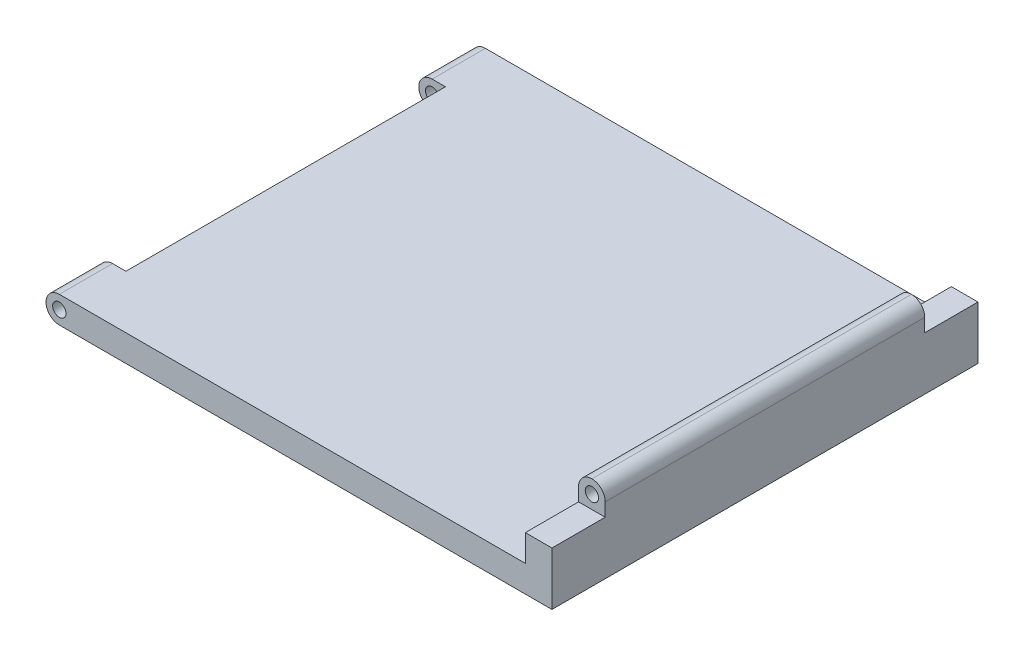
ISO-10303-21;
HEADER;
FILE_DESCRIPTION(('STEP AP214'),'2;1');
FILE_NAME('part.step','',(''),(''),'','','');
FILE_SCHEMA(('AUTOMOTIVE_DESIGN { 1 0 10303 214 1 1 1 1 }'));
ENDSEC;
DATA;
#1=APPLICATION_CONTEXT('core data for automotive mechanical design processes');
#2=APPLICATION_PROTOCOL_DEFINITION('international standard','automotive_design',2000,#1);
#3=PRODUCT_CONTEXT('',#1,'mechanical');
#4=PRODUCT('Part','Part','',(#3));
#5=PRODUCT_RELATED_PRODUCT_CATEGORY('part','',(#4));
#6=PRODUCT_DEFINITION_FORMATION('','',#4);
#7=PRODUCT_DEFINITION_CONTEXT('part definition',#1,'design');
#8=PRODUCT_DEFINITION('design','',#6,#7);
#9=PRODUCT_DEFINITION_SHAPE('','',#8);
#10=(LENGTH_UNIT() NAMED_UNIT(*) SI_UNIT(.MILLI.,.METRE.));
#11=(NAMED_UNIT(*) PLANE_ANGLE_UNIT() SI_UNIT($,.RADIAN.));
#12=(NAMED_UNIT(*) SI_UNIT($,.STERADIAN.) SOLID_ANGLE_UNIT());
#13=UNCERTAINTY_MEASURE_WITH_UNIT(LENGTH_MEASURE(1.E-05),#10,'distance_accuracy_value','');
#14=(GEOMETRIC_REPRESENTATION_CONTEXT(3) GLOBAL_UNCERTAINTY_ASSIGNED_CONTEXT((#13)) GLOBAL_UNIT_ASSIGNED_CONTEXT((#10,
#11,#12)) REPRESENTATION_CONTEXT('',''));
#15=CARTESIAN_POINT('',(0.,0.,0.));
#16=DIRECTION('',(0.,0.,1.));
#17=DIRECTION('',(1.,0.,0.));
#18=AXIS2_PLACEMENT_3D('',#15,#16,#17);
#19=CARTESIAN_POINT('',(90.,0.,40.));
#20=DIRECTION('',(-1.,0.,0.));
#21=DIRECTION('',(0.,0.,1.));
#22=AXIS2_PLACEMENT_3D('',#19,#20,#21);
#23=PLANE('',#22);
#24=DIRECTION('',(0.,1.,0.));
#25=VECTOR('',#24,1.);
#26=CARTESIAN_POINT('',(90.,15.,-30.));
#27=LINE('',#26,#25);
#28=CARTESIAN_POINT('',(90.,10.,-30.));
#29=VERTEX_POINT('',#28);
#30=CARTESIAN_POINT('',(90.,12.5,-30.));
#31=VERTEX_POINT('',#30);
#32=EDGE_CURVE('E263',#29,#31,#27,.T.);
#33=ORIENTED_EDGE('',*,*,#32,.T.);
#34=DIRECTION('',(0.,0.,-1.));
#35=VECTOR('',#34,1.);
#36=CARTESIAN_POINT('',(90.,12.5,40.));
#37=LINE('',#36,#35);
#38=CARTESIAN_POINT('',(90.,12.5,30.));
#39=VERTEX_POINT('',#38);
#40=EDGE_CURVE('E11',#31,#39,#37,.F.);
#41=ORIENTED_EDGE('',*,*,#40,.T.);
#42=DIRECTION('',(0.,1.,0.));
#43=VECTOR('',#42,1.);
#44=CARTESIAN_POINT('',(90.,15.,30.));
#45=LINE('',#44,#43);
#46=CARTESIAN_POINT('',(90.,10.,30.));
#47=VERTEX_POINT('',#46);
#48=EDGE_CURVE('E163',#47,#39,#45,.T.);
#49=ORIENTED_EDGE('',*,*,#48,.F.);
#50=DIRECTION('',(0.,0.,-1.));
#51=VECTOR('',#50,1.);
#52=CARTESIAN_POINT('',(90.,10.,40.));
#53=LINE('',#52,#51);
#54=CARTESIAN_POINT('',(90.,10.,40.));
#55=VERTEX_POINT('',#54);
#56=EDGE_CURVE('E151',#55,#47,#53,.T.);
#57=ORIENTED_EDGE('',*,*,#56,.F.);
#58=DIRECTION('',(0.,1.,0.));
#59=VECTOR('',#58,1.);
#60=CARTESIAN_POINT('',(90.,0.,40.));
#61=LINE('',#60,#59);
#62=CARTESIAN_POINT('',(90.,0.,40.));
#63=VERTEX_POINT('',#62);
#64=EDGE_CURVE('E162',#63,#55,#61,.T.);
#65=ORIENTED_EDGE('',*,*,#64,.F.);
#66=DIRECTION('',(0.,0.,-1.));
#67=VECTOR('',#66,1.);
#68=CARTESIAN_POINT('',(90.,0.,40.));
#69=LINE('',#68,#67);
#70=CARTESIAN_POINT('',(90.,0.,-40.));
#71=VERTEX_POINT('',#70);
#72=EDGE_CURVE('E203',#63,#71,#69,.T.);
#73=ORIENTED_EDGE('',*,*,#72,.T.);
#74=DIRECTION('',(0.,1.,0.));
#75=VECTOR('',#74,1.);
#76=CARTESIAN_POINT('',(90.,0.,-40.));
#77=LINE('',#76,#75);
#78=CARTESIAN_POINT('',(90.,10.,-40.));
#79=VERTEX_POINT('',#78);
#80=EDGE_CURVE('E187',#71,#79,#77,.T.);
#81=ORIENTED_EDGE('',*,*,#80,.T.);
#82=DIRECTION('',(0.,0.,1.));
#83=VECTOR('',#82,1.);
#84=CARTESIAN_POINT('',(90.,10.,-40.));
#85=LINE('',#84,#83);
#86=EDGE_CURVE('E274',#79,#29,#85,.T.);
#87=ORIENTED_EDGE('',*,*,#86,.T.);
#88=EDGE_LOOP('',(#33,#41,#49,#57,#65,#73,#81,#87));
#89=FACE_BOUND('',#88,.T.);
#90=ADVANCED_FACE('F38',(#89),#23,.F.);
#91=CARTESIAN_POINT('',(85.,15.,40.));
#92=DIRECTION('',(1.,0.,0.));
#93=DIRECTION('',(0.,0.,-1.));
#94=AXIS2_PLACEMENT_3D('',#91,#92,#93);
#95=PLANE('',#94);
#96=DIRECTION('',(0.,-1.,0.));
#97=VECTOR('',#96,1.);
#98=CARTESIAN_POINT('',(85.,15.,30.));
#99=LINE('',#98,#97);
#100=CARTESIAN_POINT('',(85.,12.5,30.));
#101=VERTEX_POINT('',#100);
#102=CARTESIAN_POINT('',(85.,10.,30.));
#103=VERTEX_POINT('',#102);
#104=EDGE_CURVE('E231',#101,#103,#99,.T.);
#105=ORIENTED_EDGE('',*,*,#104,.F.);
#106=DIRECTION('',(0.,0.,-1.));
#107=VECTOR('',#106,1.);
#108=CARTESIAN_POINT('',(85.,12.5,40.));
#109=LINE('',#108,#107);
#110=CARTESIAN_POINT('',(85.,12.5,-30.));
#111=VERTEX_POINT('',#110);
#112=EDGE_CURVE('E210',#101,#111,#109,.T.);
#113=ORIENTED_EDGE('',*,*,#112,.T.);
#114=DIRECTION('',(0.,-1.,0.));
#115=VECTOR('',#114,1.);
#116=CARTESIAN_POINT('',(85.,15.,-30.));
#117=LINE('',#116,#115);
#118=CARTESIAN_POINT('',(85.,10.,-30.));
#119=VERTEX_POINT('',#118);
#120=EDGE_CURVE('E245',#111,#119,#117,.T.);
#121=ORIENTED_EDGE('',*,*,#120,.T.);
#122=DIRECTION('',(0.,0.,1.));
#123=VECTOR('',#122,1.);
#124=CARTESIAN_POINT('',(85.,10.,-40.));
#125=LINE('',#124,#123);
#126=CARTESIAN_POINT('',(85.,10.,-40.));
#127=VERTEX_POINT('',#126);
#128=EDGE_CURVE('E270',#127,#119,#125,.T.);
#129=ORIENTED_EDGE('',*,*,#128,.F.);
#130=DIRECTION('',(0.,-1.,0.));
#131=VECTOR('',#130,1.);
#132=CARTESIAN_POINT('',(85.,15.,-40.));
#133=LINE('',#132,#131);
#134=CARTESIAN_POINT('',(85.,5.00000000000001,-40.));
#135=VERTEX_POINT('',#134);
#136=EDGE_CURVE('E192',#127,#135,#133,.T.);
#137=ORIENTED_EDGE('',*,*,#136,.T.);
#138=DIRECTION('',(0.,0.,-1.));
#139=VECTOR('',#138,1.);
#140=CARTESIAN_POINT('',(85.,5.00000000000001,40.));
#141=LINE('',#140,#139);
#142=CARTESIAN_POINT('',(85.,5.00000000000001,40.));
#143=VERTEX_POINT('',#142);
#144=EDGE_CURVE('E199',#143,#135,#141,.T.);
#145=ORIENTED_EDGE('',*,*,#144,.F.);
#146=DIRECTION('',(0.,-1.,0.));
#147=VECTOR('',#146,1.);
#148=CARTESIAN_POINT('',(85.,15.,40.));
#149=LINE('',#148,#147);
#150=CARTESIAN_POINT('',(85.,10.,40.));
#151=VERTEX_POINT('',#150);
#152=EDGE_CURVE('E171',#151,#143,#149,.T.);
#153=ORIENTED_EDGE('',*,*,#152,.F.);
#154=DIRECTION('',(0.,0.,-1.));
#155=VECTOR('',#154,1.);
#156=CARTESIAN_POINT('',(85.,10.,40.));
#157=LINE('',#156,#155);
#158=EDGE_CURVE('E153',#151,#103,#157,.T.);
#159=ORIENTED_EDGE('',*,*,#158,.T.);
#160=EDGE_LOOP('',(#105,#113,#121,#129,#137,#145,#153,#159));
#161=FACE_BOUND('',#160,.T.);
#162=ADVANCED_FACE('F236',(#161),#95,.F.);
#163=CARTESIAN_POINT('',(0.,0.,40.));
#164=DIRECTION('',(0.,0.,1.));
#165=DIRECTION('',(1.,0.,0.));
#166=AXIS2_PLACEMENT_3D('',#163,#164,#165);
#167=PLANE('',#166);
#168=CARTESIAN_POINT('',(-2.5,2.5,40.));
#169=DIRECTION('',(0.,0.,1.));
#170=DIRECTION('',(1.,0.,0.));
#171=AXIS2_PLACEMENT_3D('',#168,#169,#170);
#172=CIRCLE('',#171,1.25);
#173=CARTESIAN_POINT('',(-1.25,2.5,40.));
#174=VERTEX_POINT('',#173);
#175=EDGE_CURVE('E316',#174,#174,#172,.T.);
#176=ORIENTED_EDGE('',*,*,#175,.F.);
#177=EDGE_LOOP('',(#176));
#178=FACE_BOUND('',#177,.T.);
#179=ORIENTED_EDGE('',*,*,#64,.T.);
#180=DIRECTION('',(1.,0.,0.));
#181=VECTOR('',#180,1.);
#182=CARTESIAN_POINT('',(85.,10.,40.));
#183=LINE('',#182,#181);
#184=EDGE_CURVE('E147',#151,#55,#183,.T.);
#185=ORIENTED_EDGE('',*,*,#184,.F.);
#186=ORIENTED_EDGE('',*,*,#152,.T.);
#187=DIRECTION('',(-1.,0.,0.));
#188=VECTOR('',#187,1.);
#189=CARTESIAN_POINT('',(85.,5.00000000000001,40.));
#190=LINE('',#189,#188);
#191=CARTESIAN_POINT('',(-2.5,5.,40.));
#192=VERTEX_POINT('',#191);
#193=EDGE_CURVE('E175',#143,#192,#190,.T.);
#194=ORIENTED_EDGE('',*,*,#193,.T.);
#195=CARTESIAN_POINT('',(-2.5,2.5,40.));
#196=DIRECTION('',(0.,0.,1.));
#197=DIRECTION('',(1.,0.,0.));
#198=AXIS2_PLACEMENT_3D('',#195,#196,#197);
#199=CIRCLE('',#198,2.5);
#200=CARTESIAN_POINT('',(-2.5,0.,40.));
#201=VERTEX_POINT('',#200);
#202=EDGE_CURVE('E333',#192,#201,#199,.T.);
#203=ORIENTED_EDGE('',*,*,#202,.T.);
#204=DIRECTION('',(1.,0.,0.));
#205=VECTOR('',#204,1.);
#206=CARTESIAN_POINT('',(0.,0.,40.));
#207=LINE('',#206,#205);
#208=EDGE_CURVE('E168',#201,#63,#207,.T.);
#209=ORIENTED_EDGE('',*,*,#208,.T.);
#210=EDGE_LOOP('',(#179,#185,#186,#194,#203,#209));
#211=FACE_BOUND('',#210,.T.);
#212=ADVANCED_FACE('F166',(#178,#211),#167,.T.);
#213=CARTESIAN_POINT('',(0.,5.,40.));
#214=DIRECTION('',(1.,0.,0.));
#215=DIRECTION('',(0.,1.,0.));
#216=AXIS2_PLACEMENT_3D('',#213,#214,#215);
#217=PLANE('',#216);
#218=DIRECTION('',(0.,1.,0.));
#219=VECTOR('',#218,1.);
#220=CARTESIAN_POINT('',(0.,0.,-30.));
#221=LINE('',#220,#219);
#222=CARTESIAN_POINT('',(0.,0.,-30.));
#223=VERTEX_POINT('',#222);
#224=CARTESIAN_POINT('',(0.,5.,-30.));
#225=VERTEX_POINT('',#224);
#226=EDGE_CURVE('E286',#223,#225,#221,.T.);
#227=ORIENTED_EDGE('',*,*,#226,.F.);
#228=DIRECTION('',(0.,0.,-1.));
#229=VECTOR('',#228,1.);
#230=CARTESIAN_POINT('',(0.,0.,40.));
#231=LINE('',#230,#229);
#232=CARTESIAN_POINT('',(0.,0.,30.));
#233=VERTEX_POINT('',#232);
#234=EDGE_CURVE('E206',#233,#223,#231,.T.);
#235=ORIENTED_EDGE('',*,*,#234,.F.);
#236=DIRECTION('',(0.,1.,0.));
#237=VECTOR('',#236,1.);
#238=CARTESIAN_POINT('',(0.,0.,30.));
#239=LINE('',#238,#237);
#240=CARTESIAN_POINT('',(0.,5.,30.));
#241=VERTEX_POINT('',#240);
#242=EDGE_CURVE('E320',#233,#241,#239,.T.);
#243=ORIENTED_EDGE('',*,*,#242,.T.);
#244=DIRECTION('',(0.,0.,-1.));
#245=VECTOR('',#244,1.);
#246=CARTESIAN_POINT('',(0.,5.,40.));
#247=LINE('',#246,#245);
#248=EDGE_CURVE('E183',#241,#225,#247,.T.);
#249=ORIENTED_EDGE('',*,*,#248,.T.);
#250=EDGE_LOOP('',(#227,#235,#243,#249));
#251=FACE_BOUND('',#250,.T.);
#252=ADVANCED_FACE('F378',(#251),#217,.F.);
#253=CARTESIAN_POINT('',(0.,0.,40.));
#254=DIRECTION('',(0.,1.,0.));
#255=DIRECTION('',(0.,0.,1.));
#256=AXIS2_PLACEMENT_3D('',#253,#254,#255);
#257=PLANE('',#256);
#258=DIRECTION('',(1.,0.,0.));
#259=VECTOR('',#258,1.);
#260=CARTESIAN_POINT('',(0.,0.,-40.));
#261=LINE('',#260,#259);
#262=CARTESIAN_POINT('',(-2.5,0.,-40.));
#263=VERTEX_POINT('',#262);
#264=EDGE_CURVE('E184',#263,#71,#261,.T.);
#265=ORIENTED_EDGE('',*,*,#264,.T.);
#266=ORIENTED_EDGE('',*,*,#72,.F.);
#267=ORIENTED_EDGE('',*,*,#208,.F.);
#268=DIRECTION('',(0.,0.,-1.));
#269=VECTOR('',#268,1.);
#270=CARTESIAN_POINT('',(-2.5,0.,40.));
#271=LINE('',#270,#269);
#272=CARTESIAN_POINT('',(-2.5,0.,30.));
#273=VERTEX_POINT('',#272);
#274=EDGE_CURVE('E336',#201,#273,#271,.T.);
#275=ORIENTED_EDGE('',*,*,#274,.T.);
#276=DIRECTION('',(1.,0.,0.));
#277=VECTOR('',#276,1.);
#278=CARTESIAN_POINT('',(-2.5,0.,30.));
#279=LINE('',#278,#277);
#280=EDGE_CURVE('E330',#273,#233,#279,.T.);
#281=ORIENTED_EDGE('',*,*,#280,.T.);
#282=ORIENTED_EDGE('',*,*,#234,.T.);
#283=DIRECTION('',(1.,0.,0.));
#284=VECTOR('',#283,1.);
#285=CARTESIAN_POINT('',(-2.5,0.,-30.));
#286=LINE('',#285,#284);
#287=CARTESIAN_POINT('',(-2.5,0.,-30.));
#288=VERTEX_POINT('',#287);
#289=EDGE_CURVE('E290',#288,#223,#286,.T.);
#290=ORIENTED_EDGE('',*,*,#289,.F.);
#291=DIRECTION('',(0.,0.,1.));
#292=VECTOR('',#291,1.);
#293=CARTESIAN_POINT('',(-2.5,0.,-40.));
#294=LINE('',#293,#292);
#295=EDGE_CURVE('E309',#263,#288,#294,.T.);
#296=ORIENTED_EDGE('',*,*,#295,.F.);
#297=EDGE_LOOP('',(#265,#266,#267,#275,#281,#282,#290,#296));
#298=FACE_BOUND('',#297,.T.);
#299=ADVANCED_FACE('F357',(#298),#257,.F.);
#300=CARTESIAN_POINT('',(85.,5.00000000000001,40.));
#301=DIRECTION('',(0.,-1.,0.));
#302=DIRECTION('',(1.,0.,0.));
#303=AXIS2_PLACEMENT_3D('',#300,#301,#302);
#304=PLANE('',#303);
#305=DIRECTION('',(-1.,0.,0.));
#306=VECTOR('',#305,1.);
#307=CARTESIAN_POINT('',(85.,5.00000000000001,-40.));
#308=LINE('',#307,#306);
#309=CARTESIAN_POINT('',(-2.5,5.,-40.));
#310=VERTEX_POINT('',#309);
#311=EDGE_CURVE('E177',#135,#310,#308,.T.);
#312=ORIENTED_EDGE('',*,*,#311,.T.);
#313=DIRECTION('',(0.,0.,1.));
#314=VECTOR('',#313,1.);
#315=CARTESIAN_POINT('',(-2.5,5.,-40.));
#316=LINE('',#315,#314);
#317=CARTESIAN_POINT('',(-2.5,5.,-30.));
#318=VERTEX_POINT('',#317);
#319=EDGE_CURVE('E306',#310,#318,#316,.T.);
#320=ORIENTED_EDGE('',*,*,#319,.T.);
#321=DIRECTION('',(-1.,0.,0.));
#322=VECTOR('',#321,1.);
#323=CARTESIAN_POINT('',(0.,5.,-30.));
#324=LINE('',#323,#322);
#325=EDGE_CURVE('E298',#225,#318,#324,.T.);
#326=ORIENTED_EDGE('',*,*,#325,.F.);
#327=ORIENTED_EDGE('',*,*,#248,.F.);
#328=DIRECTION('',(-1.,0.,0.));
#329=VECTOR('',#328,1.);
#330=CARTESIAN_POINT('',(0.,5.,30.));
#331=LINE('',#330,#329);
#332=CARTESIAN_POINT('',(-2.5,5.,30.));
#333=VERTEX_POINT('',#332);
#334=EDGE_CURVE('E324',#241,#333,#331,.T.);
#335=ORIENTED_EDGE('',*,*,#334,.T.);
#336=DIRECTION('',(0.,0.,-1.));
#337=VECTOR('',#336,1.);
#338=CARTESIAN_POINT('',(-2.5,5.,40.));
#339=LINE('',#338,#337);
#340=EDGE_CURVE('E188',#192,#333,#339,.T.);
#341=ORIENTED_EDGE('',*,*,#340,.F.);
#342=ORIENTED_EDGE('',*,*,#193,.F.);
#343=ORIENTED_EDGE('',*,*,#144,.T.);
#344=EDGE_LOOP('',(#312,#320,#326,#327,#335,#341,#342,#343));
#345=FACE_BOUND('',#344,.T.);
#346=ADVANCED_FACE('F360',(#345),#304,.F.);
#347=CARTESIAN_POINT('',(0.,0.,-40.));
#348=DIRECTION('',(0.,0.,1.));
#349=DIRECTION('',(1.,0.,0.));
#350=AXIS2_PLACEMENT_3D('',#347,#348,#349);
#351=PLANE('',#350);
#352=ORIENTED_EDGE('',*,*,#136,.F.);
#353=DIRECTION('',(1.,0.,0.));
#354=VECTOR('',#353,1.);
#355=CARTESIAN_POINT('',(85.,10.,-40.));
#356=LINE('',#355,#354);
#357=EDGE_CURVE('E266',#127,#79,#356,.T.);
#358=ORIENTED_EDGE('',*,*,#357,.T.);
#359=ORIENTED_EDGE('',*,*,#80,.F.);
#360=ORIENTED_EDGE('',*,*,#264,.F.);
#361=CARTESIAN_POINT('',(-2.5,2.5,-40.));
#362=DIRECTION('',(0.,0.,1.));
#363=DIRECTION('',(1.,0.,0.));
#364=AXIS2_PLACEMENT_3D('',#361,#362,#363);
#365=CIRCLE('',#364,2.5);
#366=EDGE_CURVE('E302',#310,#263,#365,.T.);
#367=ORIENTED_EDGE('',*,*,#366,.F.);
#368=ORIENTED_EDGE('',*,*,#311,.F.);
#369=EDGE_LOOP('',(#352,#358,#359,#360,#367,#368));
#370=FACE_BOUND('',#369,.T.);
#371=CARTESIAN_POINT('',(-2.5,2.5,-40.));
#372=DIRECTION('',(0.,0.,1.));
#373=DIRECTION('',(1.,0.,0.));
#374=AXIS2_PLACEMENT_3D('',#371,#372,#373);
#375=CIRCLE('',#374,1.25);
#376=CARTESIAN_POINT('',(-1.25,2.5,-40.));
#377=VERTEX_POINT('',#376);
#378=EDGE_CURVE('E282',#377,#377,#375,.T.);
#379=ORIENTED_EDGE('',*,*,#378,.T.);
#380=EDGE_LOOP('',(#379));
#381=FACE_BOUND('',#380,.T.);
#382=ADVANCED_FACE('F366',(#370,#381),#351,.F.);
#383=CARTESIAN_POINT('',(-2.5,2.5,30.));
#384=DIRECTION('',(0.,0.,1.));
#385=DIRECTION('',(1.,0.,0.));
#386=AXIS2_PLACEMENT_3D('',#383,#384,#385);
#387=PLANE('',#386);
#388=ORIENTED_EDGE('',*,*,#242,.F.);
#389=ORIENTED_EDGE('',*,*,#280,.F.);
#390=CARTESIAN_POINT('',(-2.5,2.5,30.));
#391=DIRECTION('',(0.,0.,1.));
#392=DIRECTION('',(1.,0.,0.));
#393=AXIS2_PLACEMENT_3D('',#390,#391,#392);
#394=CIRCLE('',#393,2.5);
#395=EDGE_CURVE('E327',#333,#273,#394,.T.);
#396=ORIENTED_EDGE('',*,*,#395,.F.);
#397=ORIENTED_EDGE('',*,*,#334,.F.);
#398=EDGE_LOOP('',(#388,#389,#396,#397));
#399=FACE_BOUND('',#398,.T.);
#400=CARTESIAN_POINT('',(-2.5,2.5,30.));
#401=DIRECTION('',(0.,0.,1.));
#402=DIRECTION('',(1.,0.,0.));
#403=AXIS2_PLACEMENT_3D('',#400,#401,#402);
#404=CIRCLE('',#403,1.25);
#405=CARTESIAN_POINT('',(-1.25,2.5,30.));
#406=VERTEX_POINT('',#405);
#407=EDGE_CURVE('E312',#406,#406,#404,.T.);
#408=ORIENTED_EDGE('',*,*,#407,.T.);
#409=EDGE_LOOP('',(#408));
#410=FACE_BOUND('',#409,.T.);
#411=ADVANCED_FACE('F353',(#399,#410),#387,.F.);
#412=CARTESIAN_POINT('',(-2.5,2.5,40.));
#413=DIRECTION('',(0.,0.,-1.));
#414=DIRECTION('',(-1.,0.,0.));
#415=AXIS2_PLACEMENT_3D('',#412,#413,#414);
#416=CYLINDRICAL_SURFACE('',#415,2.5);
#417=ORIENTED_EDGE('',*,*,#395,.T.);
#418=ORIENTED_EDGE('',*,*,#274,.F.);
#419=ORIENTED_EDGE('',*,*,#202,.F.);
#420=ORIENTED_EDGE('',*,*,#340,.T.);
#421=EDGE_LOOP('',(#417,#418,#419,#420));
#422=FACE_BOUND('',#421,.T.);
#423=ADVANCED_FACE('F346',(#422),#416,.T.);
#424=CARTESIAN_POINT('',(-2.5,2.5,40.));
#425=DIRECTION('',(0.,0.,-1.));
#426=DIRECTION('',(-1.,0.,0.));
#427=AXIS2_PLACEMENT_3D('',#424,#425,#426);
#428=CYLINDRICAL_SURFACE('',#427,1.25);
#429=ORIENTED_EDGE('',*,*,#175,.T.);
#430=EDGE_LOOP('',(#429));
#431=FACE_BOUND('',#430,.T.);
#432=ORIENTED_EDGE('',*,*,#407,.F.);
#433=EDGE_LOOP('',(#432));
#434=FACE_BOUND('',#433,.T.);
#435=ADVANCED_FACE('F402',(#431,#434),#428,.F.);
#436=CARTESIAN_POINT('',(-2.5,2.5,-40.));
#437=DIRECTION('',(0.,0.,1.));
#438=DIRECTION('',(1.,0.,0.));
#439=AXIS2_PLACEMENT_3D('',#436,#437,#438);
#440=CYLINDRICAL_SURFACE('',#439,2.5);
#441=CARTESIAN_POINT('',(-2.5,2.5,-30.));
#442=DIRECTION('',(0.,0.,1.));
#443=DIRECTION('',(1.,0.,0.));
#444=AXIS2_PLACEMENT_3D('',#441,#442,#443);
#445=CIRCLE('',#444,2.5);
#446=EDGE_CURVE('E294',#318,#288,#445,.T.);
#447=ORIENTED_EDGE('',*,*,#446,.F.);
#448=ORIENTED_EDGE('',*,*,#319,.F.);
#449=ORIENTED_EDGE('',*,*,#366,.T.);
#450=ORIENTED_EDGE('',*,*,#295,.T.);
#451=EDGE_LOOP('',(#447,#448,#449,#450));
#452=FACE_BOUND('',#451,.T.);
#453=ADVANCED_FACE('F372',(#452),#440,.T.);
#454=CARTESIAN_POINT('',(-2.5,2.5,-30.));
#455=DIRECTION('',(0.,0.,-1.));
#456=DIRECTION('',(1.,0.,0.));
#457=AXIS2_PLACEMENT_3D('',#454,#455,#456);
#458=PLANE('',#457);
#459=CARTESIAN_POINT('',(-2.5,2.5,-30.));
#460=DIRECTION('',(0.,0.,1.));
#461=DIRECTION('',(1.,0.,0.));
#462=AXIS2_PLACEMENT_3D('',#459,#460,#461);
#463=CIRCLE('',#462,1.25);
#464=CARTESIAN_POINT('',(-1.25,2.5,-30.));
#465=VERTEX_POINT('',#464);
#466=EDGE_CURVE('E278',#465,#465,#463,.T.);
#467=ORIENTED_EDGE('',*,*,#466,.F.);
#468=EDGE_LOOP('',(#467));
#469=FACE_BOUND('',#468,.T.);
#470=ORIENTED_EDGE('',*,*,#226,.T.);
#471=ORIENTED_EDGE('',*,*,#325,.T.);
#472=ORIENTED_EDGE('',*,*,#446,.T.);
#473=ORIENTED_EDGE('',*,*,#289,.T.);
#474=EDGE_LOOP('',(#470,#471,#472,#473));
#475=FACE_BOUND('',#474,.T.);
#476=ADVANCED_FACE('F376',(#469,#475),#458,.F.);
#477=CARTESIAN_POINT('',(-2.5,2.5,-40.));
#478=DIRECTION('',(0.,0.,1.));
#479=DIRECTION('',(1.,0.,0.));
#480=AXIS2_PLACEMENT_3D('',#477,#478,#479);
#481=CYLINDRICAL_SURFACE('',#480,1.25);
#482=ORIENTED_EDGE('',*,*,#378,.F.);
#483=EDGE_LOOP('',(#482));
#484=FACE_BOUND('',#483,.T.);
#485=ORIENTED_EDGE('',*,*,#466,.T.);
#486=EDGE_LOOP('',(#485));
#487=FACE_BOUND('',#486,.T.);
#488=ADVANCED_FACE('F412',(#484,#487),#481,.F.);
#489=CARTESIAN_POINT('',(85.,10.,-40.));
#490=DIRECTION('',(0.,-1.,0.));
#491=DIRECTION('',(0.,0.,-1.));
#492=AXIS2_PLACEMENT_3D('',#489,#490,#491);
#493=PLANE('',#492);
#494=DIRECTION('',(1.,0.,0.));
#495=VECTOR('',#494,1.);
#496=CARTESIAN_POINT('',(85.,10.,-30.));
#497=LINE('',#496,#495);
#498=EDGE_CURVE('E259',#119,#29,#497,.T.);
#499=ORIENTED_EDGE('',*,*,#498,.T.);
#500=ORIENTED_EDGE('',*,*,#86,.F.);
#501=ORIENTED_EDGE('',*,*,#357,.F.);
#502=ORIENTED_EDGE('',*,*,#128,.T.);
#503=EDGE_LOOP('',(#499,#500,#501,#502));
#504=FACE_BOUND('',#503,.T.);
#505=ADVANCED_FACE('F416',(#504),#493,.F.);
#506=CARTESIAN_POINT('',(0.,0.,-30.));
#507=DIRECTION('',(0.,0.,1.));
#508=DIRECTION('',(1.,0.,0.));
#509=AXIS2_PLACEMENT_3D('',#506,#507,#508);
#510=PLANE('',#509);
#511=CARTESIAN_POINT('',(87.5,12.5,-30.));
#512=DIRECTION('',(0.,0.,1.));
#513=DIRECTION('',(1.,0.,0.));
#514=AXIS2_PLACEMENT_3D('',#511,#512,#513);
#515=CIRCLE('',#514,1.25);
#516=CARTESIAN_POINT('',(88.75,12.5,-30.));
#517=VERTEX_POINT('',#516);
#518=EDGE_CURVE('E215',#517,#517,#515,.T.);
#519=ORIENTED_EDGE('',*,*,#518,.T.);
#520=EDGE_LOOP('',(#519));
#521=FACE_BOUND('',#520,.T.);
#522=ORIENTED_EDGE('',*,*,#120,.F.);
#523=CARTESIAN_POINT('',(87.5,12.5,-30.));
#524=DIRECTION('',(0.,0.,1.));
#525=DIRECTION('',(1.,0.,0.));
#526=AXIS2_PLACEMENT_3D('',#523,#524,#525);
#527=CIRCLE('',#526,2.5);
#528=CARTESIAN_POINT('',(87.5,15.,-30.));
#529=VERTEX_POINT('',#528);
#530=EDGE_CURVE('E222',#111,#529,#527,.F.);
#531=ORIENTED_EDGE('',*,*,#530,.T.);
#532=CARTESIAN_POINT('',(87.5,12.5,-30.));
#533=DIRECTION('',(0.,0.,1.));
#534=DIRECTION('',(1.,0.,0.));
#535=AXIS2_PLACEMENT_3D('',#532,#533,#534);
#536=CIRCLE('',#535,2.5);
#537=EDGE_CURVE('E219',#529,#31,#536,.F.);
#538=ORIENTED_EDGE('',*,*,#537,.T.);
#539=ORIENTED_EDGE('',*,*,#32,.F.);
#540=ORIENTED_EDGE('',*,*,#498,.F.);
#541=EDGE_LOOP('',(#522,#531,#538,#539,#540));
#542=FACE_BOUND('',#541,.T.);
#543=ADVANCED_FACE('F243',(#521,#542),#510,.F.);
#544=CARTESIAN_POINT('',(85.,10.,40.));
#545=DIRECTION('',(0.,1.,0.));
#546=DIRECTION('',(0.,0.,1.));
#547=AXIS2_PLACEMENT_3D('',#544,#545,#546);
#548=PLANE('',#547);
#549=DIRECTION('',(1.,0.,0.));
#550=VECTOR('',#549,1.);
#551=CARTESIAN_POINT('',(85.,10.,30.));
#552=LINE('',#551,#550);
#553=EDGE_CURVE('E158',#103,#47,#552,.T.);
#554=ORIENTED_EDGE('',*,*,#553,.F.);
#555=ORIENTED_EDGE('',*,*,#158,.F.);
#556=ORIENTED_EDGE('',*,*,#184,.T.);
#557=ORIENTED_EDGE('',*,*,#56,.T.);
#558=EDGE_LOOP('',(#554,#555,#556,#557));
#559=FACE_BOUND('',#558,.T.);
#560=ADVANCED_FACE('F150',(#559),#548,.T.);
#561=CARTESIAN_POINT('',(0.,0.,30.));
#562=DIRECTION('',(0.,0.,-1.));
#563=DIRECTION('',(1.,0.,0.));
#564=AXIS2_PLACEMENT_3D('',#561,#562,#563);
#565=PLANE('',#564);
#566=CARTESIAN_POINT('',(87.5,12.5,30.));
#567=DIRECTION('',(0.,0.,-1.));
#568=DIRECTION('',(-1.,0.,0.));
#569=AXIS2_PLACEMENT_3D('',#566,#567,#568);
#570=CIRCLE('',#569,1.25);
#571=CARTESIAN_POINT('',(86.25,12.5,30.));
#572=VERTEX_POINT('',#571);
#573=EDGE_CURVE('E211',#572,#572,#570,.T.);
#574=ORIENTED_EDGE('',*,*,#573,.T.);
#575=EDGE_LOOP('',(#574));
#576=FACE_BOUND('',#575,.T.);
#577=CARTESIAN_POINT('',(87.5,12.5,30.));
#578=DIRECTION('',(0.,0.,-1.));
#579=DIRECTION('',(-1.,0.,0.));
#580=AXIS2_PLACEMENT_3D('',#577,#578,#579);
#581=CIRCLE('',#580,2.5);
#582=CARTESIAN_POINT('',(87.5,15.,30.));
#583=VERTEX_POINT('',#582);
#584=EDGE_CURVE('E55',#39,#583,#581,.F.);
#585=ORIENTED_EDGE('',*,*,#584,.T.);
#586=CARTESIAN_POINT('',(87.5,12.5,30.));
#587=DIRECTION('',(0.,0.,-1.));
#588=DIRECTION('',(-1.,0.,0.));
#589=AXIS2_PLACEMENT_3D('',#586,#587,#588);
#590=CIRCLE('',#589,2.5);
#591=EDGE_CURVE('E48',#583,#101,#590,.F.);
#592=ORIENTED_EDGE('',*,*,#591,.T.);
#593=ORIENTED_EDGE('',*,*,#104,.T.);
#594=ORIENTED_EDGE('',*,*,#553,.T.);
#595=ORIENTED_EDGE('',*,*,#48,.T.);
#596=EDGE_LOOP('',(#585,#592,#593,#594,#595));
#597=FACE_BOUND('',#596,.T.);
#598=ADVANCED_FACE('F230',(#576,#597),#565,.F.);
#599=CARTESIAN_POINT('',(87.5,12.5,-40.));
#600=DIRECTION('',(0.,0.,1.));
#601=DIRECTION('',(1.,0.,0.));
#602=AXIS2_PLACEMENT_3D('',#599,#600,#601);
#603=CYLINDRICAL_SURFACE('',#602,1.25);
#604=ORIENTED_EDGE('',*,*,#573,.F.);
#605=EDGE_LOOP('',(#604));
#606=FACE_BOUND('',#605,.T.);
#607=ORIENTED_EDGE('',*,*,#518,.F.);
#608=EDGE_LOOP('',(#607));
#609=FACE_BOUND('',#608,.T.);
#610=ADVANCED_FACE('F428',(#606,#609),#603,.F.);
#611=CARTESIAN_POINT('',(87.5,12.5,40.));
#612=DIRECTION('',(0.,0.,-1.));
#613=DIRECTION('',(-1.,0.,0.));
#614=AXIS2_PLACEMENT_3D('',#611,#612,#613);
#615=CYLINDRICAL_SURFACE('',#614,2.5);
#616=DIRECTION('',(0.,0.,-1.));
#617=VECTOR('',#616,1.);
#618=CARTESIAN_POINT('',(87.5,15.,40.));
#619=LINE('',#618,#617);
#620=EDGE_CURVE('E42',#583,#529,#619,.T.);
#621=ORIENTED_EDGE('',*,*,#620,.F.);
#622=ORIENTED_EDGE('',*,*,#584,.F.);
#623=ORIENTED_EDGE('',*,*,#40,.F.);
#624=ORIENTED_EDGE('',*,*,#537,.F.);
#625=EDGE_LOOP('',(#621,#622,#623,#624));
#626=FACE_BOUND('',#625,.T.);
#627=ADVANCED_FACE('F40',(#626),#615,.T.);
#628=CARTESIAN_POINT('',(87.5,12.5,40.));
#629=DIRECTION('',(0.,0.,-1.));
#630=DIRECTION('',(-1.,0.,0.));
#631=AXIS2_PLACEMENT_3D('',#628,#629,#630);
#632=CYLINDRICAL_SURFACE('',#631,2.5);
#633=ORIENTED_EDGE('',*,*,#591,.F.);
#634=ORIENTED_EDGE('',*,*,#620,.T.);
#635=ORIENTED_EDGE('',*,*,#530,.F.);
#636=ORIENTED_EDGE('',*,*,#112,.F.);
#637=EDGE_LOOP('',(#633,#634,#635,#636));
#638=FACE_BOUND('',#637,.T.);
#639=ADVANCED_FACE('F240',(#638),#632,.T.);
#640=CLOSED_SHELL('',(#90,#162,#212,#252,#299,#346,#382,#411,#423,#435,#453,#476,#488,#505,#543,
#560,#598,#610,#627,#639));
#641=MANIFOLD_SOLID_BREP('B2',#640);
#642=ADVANCED_BREP_SHAPE_REPRESENTATION('',(#18,#641),#14);
#643=SHAPE_DEFINITION_REPRESENTATION(#9,#642);
ENDSEC;
END-ISO-10303-21;
